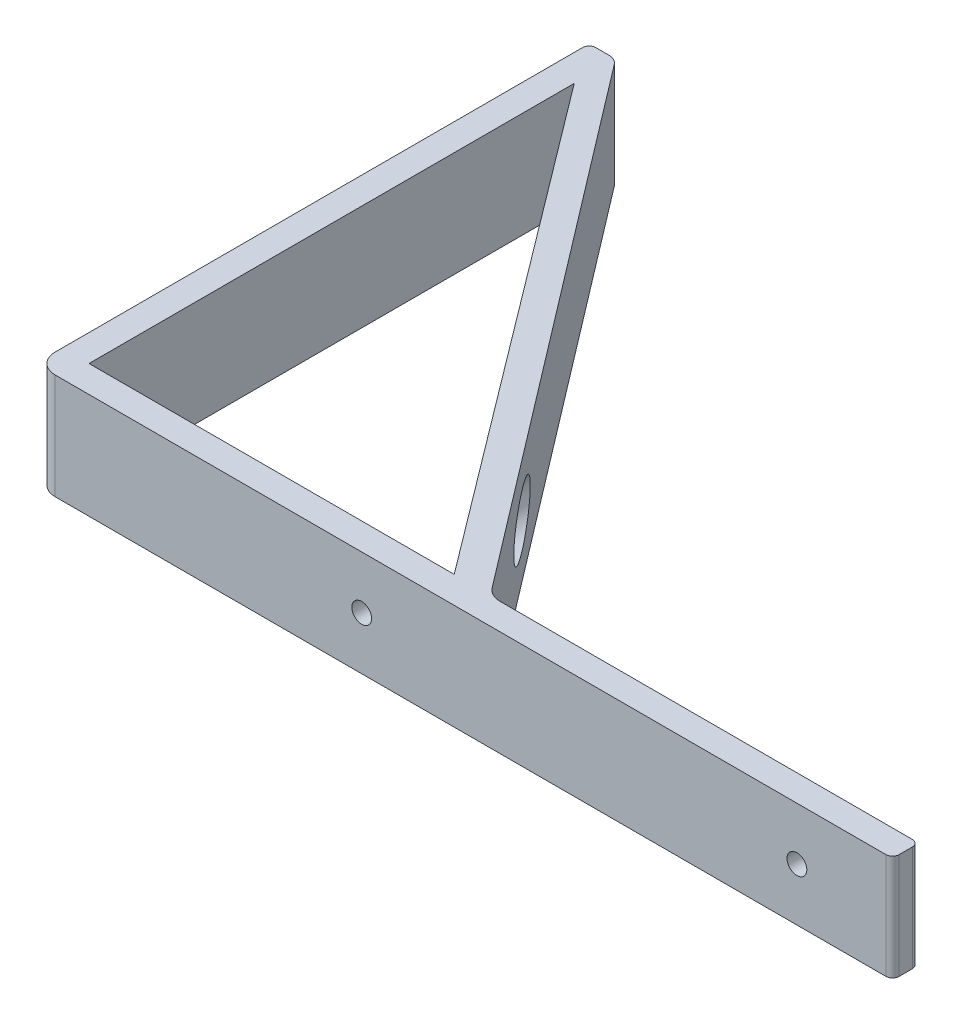
ISO-10303-21;
HEADER;
FILE_DESCRIPTION(('STEP AP214'),'2;1');
FILE_NAME('part.step','',(''),(''),'','','');
FILE_SCHEMA(('AUTOMOTIVE_DESIGN { 1 0 10303 214 1 1 1 1 }'));
ENDSEC;
DATA;
#1=APPLICATION_CONTEXT('core data for automotive mechanical design processes');
#2=APPLICATION_PROTOCOL_DEFINITION('international standard','automotive_design',2000,#1);
#3=PRODUCT_CONTEXT('',#1,'mechanical');
#4=PRODUCT('Part','Part','',(#3));
#5=PRODUCT_RELATED_PRODUCT_CATEGORY('part','',(#4));
#6=PRODUCT_DEFINITION_FORMATION('','',#4);
#7=PRODUCT_DEFINITION_CONTEXT('part definition',#1,'design');
#8=PRODUCT_DEFINITION('design','',#6,#7);
#9=PRODUCT_DEFINITION_SHAPE('','',#8);
#10=(LENGTH_UNIT() NAMED_UNIT(*) SI_UNIT(.MILLI.,.METRE.));
#11=(NAMED_UNIT(*) PLANE_ANGLE_UNIT() SI_UNIT($,.RADIAN.));
#12=(NAMED_UNIT(*) SI_UNIT($,.STERADIAN.) SOLID_ANGLE_UNIT());
#13=UNCERTAINTY_MEASURE_WITH_UNIT(LENGTH_MEASURE(1.E-05),#10,'distance_accuracy_value','');
#14=(GEOMETRIC_REPRESENTATION_CONTEXT(3) GLOBAL_UNCERTAINTY_ASSIGNED_CONTEXT((#13)) GLOBAL_UNIT_ASSIGNED_CONTEXT((#10,
#11,#12)) REPRESENTATION_CONTEXT('',''));
#15=CARTESIAN_POINT('',(0.,0.,0.));
#16=DIRECTION('',(0.,0.,1.));
#17=DIRECTION('',(1.,0.,0.));
#18=AXIS2_PLACEMENT_3D('',#15,#16,#17);
#19=CARTESIAN_POINT('',(-102.832594316858,16.,-4.60648524114411));
#20=DIRECTION('',(0.,1.,0.));
#21=DIRECTION('',(0.,0.,1.));
#22=AXIS2_PLACEMENT_3D('',#19,#20,#21);
#23=PLANE('',#22);
#24=CARTESIAN_POINT('',(-102.832594316858,16.,-4.60648524114411));
#25=DIRECTION('',(0.,1.,0.));
#26=DIRECTION('',(0.,0.,1.));
#27=AXIS2_PLACEMENT_3D('',#24,#25,#26);
#28=CIRCLE('',#27,3.);
#29=CARTESIAN_POINT('',(-105.832594316858,16.,-4.60648524114411));
#30=VERTEX_POINT('',#29);
#31=CARTESIAN_POINT('',(-102.832594316858,16.,-1.60648524114411));
#32=VERTEX_POINT('',#31);
#33=EDGE_CURVE('E170',#30,#32,#28,.T.);
#34=ORIENTED_EDGE('',*,*,#33,.T.);
#35=DIRECTION('',(1.,0.,0.));
#36=VECTOR('',#35,1.);
#37=CARTESIAN_POINT('',(-102.832594316858,16.,-1.60648524114411));
#38=LINE('',#37,#36);
#39=CARTESIAN_POINT('',(23.1674056831416,16.,-1.60648524114411));
#40=VERTEX_POINT('',#39);
#41=EDGE_CURVE('E173',#32,#40,#38,.T.);
#42=ORIENTED_EDGE('',*,*,#41,.T.);
#43=CARTESIAN_POINT('',(23.1674056831416,16.,-2.60648524114411));
#44=DIRECTION('',(0.,1.,0.));
#45=DIRECTION('',(0.,0.,1.));
#46=AXIS2_PLACEMENT_3D('',#43,#44,#45);
#47=CIRCLE('',#46,1.);
#48=CARTESIAN_POINT('',(24.1674056831416,16.,-2.60648524114411));
#49=VERTEX_POINT('',#48);
#50=EDGE_CURVE('E176',#40,#49,#47,.T.);
#51=ORIENTED_EDGE('',*,*,#50,.T.);
#52=DIRECTION('',(0.,0.,1.));
#53=VECTOR('',#52,1.);
#54=CARTESIAN_POINT('',(24.1674056831416,16.,-4.60648524114411));
#55=LINE('',#54,#53);
#56=CARTESIAN_POINT('',(24.1674056831416,16.,-4.60648524114411));
#57=VERTEX_POINT('',#56);
#58=EDGE_CURVE('E178',#57,#49,#55,.T.);
#59=ORIENTED_EDGE('',*,*,#58,.F.);
#60=CARTESIAN_POINT('',(23.1674056831416,16.,-4.60648524114411));
#61=DIRECTION('',(0.,1.,0.));
#62=DIRECTION('',(0.,0.,1.));
#63=AXIS2_PLACEMENT_3D('',#60,#61,#62);
#64=CIRCLE('',#63,1.);
#65=CARTESIAN_POINT('',(23.1674056831416,16.,-5.60648524114411));
#66=VERTEX_POINT('',#65);
#67=EDGE_CURVE('E181',#57,#66,#64,.T.);
#68=ORIENTED_EDGE('',*,*,#67,.T.);
#69=DIRECTION('',(1.,0.,0.));
#70=VECTOR('',#69,1.);
#71=CARTESIAN_POINT('',(-39.3524200308223,16.,-5.60648524114411));
#72=LINE('',#71,#70);
#73=CARTESIAN_POINT('',(-39.3524200308223,16.,-5.60648524114411));
#74=VERTEX_POINT('',#73);
#75=EDGE_CURVE('E183',#74,#66,#72,.T.);
#76=ORIENTED_EDGE('',*,*,#75,.F.);
#77=CARTESIAN_POINT('',(-39.3524200308223,16.,-8.6064852411441));
#78=DIRECTION('',(0.,1.,0.));
#79=DIRECTION('',(0.,0.,1.));
#80=AXIS2_PLACEMENT_3D('',#77,#78,#79);
#81=CIRCLE('',#80,3.00000000000001);
#82=CARTESIAN_POINT('',(-41.7380304850673,16.,-6.78745726978226));
#83=VERTEX_POINT('',#82);
#84=EDGE_CURVE('E186',#83,#74,#81,.T.);
#85=ORIENTED_EDGE('',*,*,#84,.F.);
#86=DIRECTION('',(0.606342657120614,0.,0.795203484748346));
#87=VECTOR('',#86,1.);
#88=CARTESIAN_POINT('',(-101.232266868967,16.,-84.8126853142412));
#89=LINE('',#88,#87);
#90=CARTESIAN_POINT('',(-101.232266868967,16.,-84.8126853142412));
#91=VERTEX_POINT('',#90);
#92=EDGE_CURVE('E189',#91,#83,#89,.T.);
#93=ORIENTED_EDGE('',*,*,#92,.F.);
#94=CARTESIAN_POINT('',(-102.822673838464,16.,-83.6));
#95=DIRECTION('',(0.,-1.,0.));
#96=DIRECTION('',(0.,0.,-1.));
#97=AXIS2_PLACEMENT_3D('',#94,#95,#96);
#98=CIRCLE('',#97,2.);
#99=CARTESIAN_POINT('',(-102.822673838464,16.,-85.6));
#100=VERTEX_POINT('',#99);
#101=EDGE_CURVE('E192',#100,#91,#98,.T.);
#102=ORIENTED_EDGE('',*,*,#101,.F.);
#103=DIRECTION('',(1.,0.,0.));
#104=VECTOR('',#103,1.);
#105=CARTESIAN_POINT('',(-104.832594316858,16.,-85.6));
#106=LINE('',#105,#104);
#107=CARTESIAN_POINT('',(-104.832594316858,16.,-85.6));
#108=VERTEX_POINT('',#107);
#109=EDGE_CURVE('E195',#108,#100,#106,.T.);
#110=ORIENTED_EDGE('',*,*,#109,.F.);
#111=CARTESIAN_POINT('',(-104.832594316858,16.,-84.6));
#112=DIRECTION('',(0.,1.,0.));
#113=DIRECTION('',(0.,0.,1.));
#114=AXIS2_PLACEMENT_3D('',#111,#112,#113);
#115=CIRCLE('',#114,1.);
#116=CARTESIAN_POINT('',(-105.832594316858,16.,-84.6));
#117=VERTEX_POINT('',#116);
#118=EDGE_CURVE('E198',#108,#117,#115,.T.);
#119=ORIENTED_EDGE('',*,*,#118,.T.);
#120=DIRECTION('',(0.,0.,-1.));
#121=VECTOR('',#120,1.);
#122=CARTESIAN_POINT('',(-105.832594316858,16.,-5.59999999999999));
#123=LINE('',#122,#121);
#124=EDGE_CURVE('E200',#30,#117,#123,.T.);
#125=ORIENTED_EDGE('',*,*,#124,.F.);
#126=EDGE_LOOP('',(#34,#42,#51,#59,#68,#76,#85,#93,#102,#110,#119,#125));
#127=FACE_BOUND('',#126,.T.);
#128=DIRECTION('',(1.,0.,0.));
#129=VECTOR('',#128,1.);
#130=CARTESIAN_POINT('',(-101.761672648414,16.,-5.67740690958808));
#131=LINE('',#130,#129);
#132=CARTESIAN_POINT('',(-101.761672648414,16.,-5.67740690958808));
#133=VERTEX_POINT('',#132);
#134=CARTESIAN_POINT('',(-46.3765232221607,16.,-5.67740690958808));
#135=VERTEX_POINT('',#134);
#136=EDGE_CURVE('E151',#133,#135,#131,.T.);
#137=ORIENTED_EDGE('',*,*,#136,.F.);
#138=DIRECTION('',(0.,0.,-1.));
#139=VECTOR('',#138,1.);
#140=CARTESIAN_POINT('',(-101.761672648414,16.,-5.67740690958808));
#141=LINE('',#140,#139);
#142=CARTESIAN_POINT('',(-101.761672648414,16.,-79.2663502076995));
#143=VERTEX_POINT('',#142);
#144=EDGE_CURVE('E50',#133,#143,#141,.T.);
#145=ORIENTED_EDGE('',*,*,#144,.T.);
#146=DIRECTION('',(0.601343340428703,0.,0.798990730185306));
#147=VECTOR('',#146,1.);
#148=CARTESIAN_POINT('',(-101.761672648414,16.,-79.2663502076995));
#149=LINE('',#148,#147);
#150=EDGE_CURVE('E156',#143,#135,#149,.T.);
#151=ORIENTED_EDGE('',*,*,#150,.T.);
#152=EDGE_LOOP('',(#137,#145,#151));
#153=FACE_BOUND('',#152,.T.);
#154=ADVANCED_FACE('F33',(#127,#153),#23,.T.);
#155=CARTESIAN_POINT('',(-102.832594316858,0.,-4.60648524114411));
#156=DIRECTION('',(0.,1.,0.));
#157=DIRECTION('',(0.,0.,1.));
#158=AXIS2_PLACEMENT_3D('',#155,#156,#157);
#159=PLANE('',#158);
#160=CARTESIAN_POINT('',(-102.832594316858,0.,-4.60648524114411));
#161=DIRECTION('',(0.,1.,0.));
#162=DIRECTION('',(0.,0.,1.));
#163=AXIS2_PLACEMENT_3D('',#160,#161,#162);
#164=CIRCLE('',#163,3.);
#165=CARTESIAN_POINT('',(-105.832594316858,0.,-4.60648524114411));
#166=VERTEX_POINT('',#165);
#167=CARTESIAN_POINT('',(-102.832594316858,0.,-1.60648524114411));
#168=VERTEX_POINT('',#167);
#169=EDGE_CURVE('E157',#166,#168,#164,.T.);
#170=ORIENTED_EDGE('',*,*,#169,.F.);
#171=DIRECTION('',(0.,0.,1.));
#172=VECTOR('',#171,1.);
#173=CARTESIAN_POINT('',(-105.832594316858,0.,-5.59999999999999));
#174=LINE('',#173,#172);
#175=CARTESIAN_POINT('',(-105.832594316858,0.,-84.6));
#176=VERTEX_POINT('',#175);
#177=EDGE_CURVE('E174',#176,#166,#174,.T.);
#178=ORIENTED_EDGE('',*,*,#177,.F.);
#179=CARTESIAN_POINT('',(-104.832594316858,0.,-84.6));
#180=DIRECTION('',(0.,1.,0.));
#181=DIRECTION('',(0.,0.,1.));
#182=AXIS2_PLACEMENT_3D('',#179,#180,#181);
#183=CIRCLE('',#182,1.);
#184=CARTESIAN_POINT('',(-104.832594316858,0.,-85.6));
#185=VERTEX_POINT('',#184);
#186=EDGE_CURVE('E232',#185,#176,#183,.T.);
#187=ORIENTED_EDGE('',*,*,#186,.F.);
#188=DIRECTION('',(1.,0.,0.));
#189=VECTOR('',#188,1.);
#190=CARTESIAN_POINT('',(-104.832594316858,0.,-85.6));
#191=LINE('',#190,#189);
#192=CARTESIAN_POINT('',(-102.822673838464,0.,-85.6));
#193=VERTEX_POINT('',#192);
#194=EDGE_CURVE('E229',#185,#193,#191,.T.);
#195=ORIENTED_EDGE('',*,*,#194,.T.);
#196=CARTESIAN_POINT('',(-102.822673838464,0.,-83.6));
#197=DIRECTION('',(0.,-1.,0.));
#198=DIRECTION('',(0.,0.,-1.));
#199=AXIS2_PLACEMENT_3D('',#196,#197,#198);
#200=CIRCLE('',#199,2.);
#201=CARTESIAN_POINT('',(-101.232266868967,0.,-84.8126853142412));
#202=VERTEX_POINT('',#201);
#203=EDGE_CURVE('E226',#193,#202,#200,.T.);
#204=ORIENTED_EDGE('',*,*,#203,.T.);
#205=DIRECTION('',(0.606342657120614,0.,0.795203484748346));
#206=VECTOR('',#205,1.);
#207=CARTESIAN_POINT('',(-101.232266868967,0.,-84.8126853142412));
#208=LINE('',#207,#206);
#209=CARTESIAN_POINT('',(-41.7380304850673,0.,-6.78745726978226));
#210=VERTEX_POINT('',#209);
#211=EDGE_CURVE('E223',#202,#210,#208,.T.);
#212=ORIENTED_EDGE('',*,*,#211,.T.);
#213=CARTESIAN_POINT('',(-39.3524200308223,0.,-8.6064852411441));
#214=DIRECTION('',(0.,1.,0.));
#215=DIRECTION('',(0.,0.,1.));
#216=AXIS2_PLACEMENT_3D('',#213,#214,#215);
#217=CIRCLE('',#216,3.00000000000001);
#218=CARTESIAN_POINT('',(-39.3524200308223,0.,-5.60648524114411));
#219=VERTEX_POINT('',#218);
#220=EDGE_CURVE('E220',#210,#219,#217,.T.);
#221=ORIENTED_EDGE('',*,*,#220,.T.);
#222=DIRECTION('',(1.,0.,0.));
#223=VECTOR('',#222,1.);
#224=CARTESIAN_POINT('',(-39.3524200308223,0.,-5.60648524114411));
#225=LINE('',#224,#223);
#226=CARTESIAN_POINT('',(23.1674056831416,0.,-5.60648524114411));
#227=VERTEX_POINT('',#226);
#228=EDGE_CURVE('E217',#219,#227,#225,.T.);
#229=ORIENTED_EDGE('',*,*,#228,.T.);
#230=CARTESIAN_POINT('',(23.1674056831416,0.,-4.60648524114411));
#231=DIRECTION('',(0.,1.,0.));
#232=DIRECTION('',(0.,0.,1.));
#233=AXIS2_PLACEMENT_3D('',#230,#231,#232);
#234=CIRCLE('',#233,1.);
#235=CARTESIAN_POINT('',(24.1674056831416,0.,-4.60648524114411));
#236=VERTEX_POINT('',#235);
#237=EDGE_CURVE('E214',#236,#227,#234,.T.);
#238=ORIENTED_EDGE('',*,*,#237,.F.);
#239=DIRECTION('',(0.,0.,1.));
#240=VECTOR('',#239,1.);
#241=CARTESIAN_POINT('',(24.1674056831416,0.,-4.60648524114411));
#242=LINE('',#241,#240);
#243=CARTESIAN_POINT('',(24.1674056831416,0.,-2.60648524114411));
#244=VERTEX_POINT('',#243);
#245=EDGE_CURVE('E211',#236,#244,#242,.T.);
#246=ORIENTED_EDGE('',*,*,#245,.T.);
#247=CARTESIAN_POINT('',(23.1674056831416,0.,-2.60648524114411));
#248=DIRECTION('',(0.,1.,0.));
#249=DIRECTION('',(0.,0.,1.));
#250=AXIS2_PLACEMENT_3D('',#247,#248,#249);
#251=CIRCLE('',#250,1.);
#252=CARTESIAN_POINT('',(23.1674056831416,0.,-1.60648524114411));
#253=VERTEX_POINT('',#252);
#254=EDGE_CURVE('E208',#253,#244,#251,.T.);
#255=ORIENTED_EDGE('',*,*,#254,.F.);
#256=DIRECTION('',(1.,0.,0.));
#257=VECTOR('',#256,1.);
#258=CARTESIAN_POINT('',(-102.832594316858,0.,-1.60648524114411));
#259=LINE('',#258,#257);
#260=EDGE_CURVE('E206',#168,#253,#259,.T.);
#261=ORIENTED_EDGE('',*,*,#260,.F.);
#262=EDGE_LOOP('',(#170,#178,#187,#195,#204,#212,#221,#229,#238,#246,#255,#261));
#263=FACE_BOUND('',#262,.T.);
#264=DIRECTION('',(0.,0.,-1.));
#265=VECTOR('',#264,1.);
#266=CARTESIAN_POINT('',(-101.761672648414,0.,-5.67740690958808));
#267=LINE('',#266,#265);
#268=CARTESIAN_POINT('',(-101.761672648414,0.,-5.67740690958808));
#269=VERTEX_POINT('',#268);
#270=CARTESIAN_POINT('',(-101.761672648414,0.,-79.2663502076995));
#271=VERTEX_POINT('',#270);
#272=EDGE_CURVE('E142',#269,#271,#267,.T.);
#273=ORIENTED_EDGE('',*,*,#272,.F.);
#274=DIRECTION('',(1.,0.,0.));
#275=VECTOR('',#274,1.);
#276=CARTESIAN_POINT('',(-101.761672648414,0.,-5.67740690958808));
#277=LINE('',#276,#275);
#278=CARTESIAN_POINT('',(-46.3765232221607,0.,-5.67740690958808));
#279=VERTEX_POINT('',#278);
#280=EDGE_CURVE('E160',#269,#279,#277,.T.);
#281=ORIENTED_EDGE('',*,*,#280,.T.);
#282=DIRECTION('',(0.601343340428703,0.,0.798990730185306));
#283=VECTOR('',#282,1.);
#284=CARTESIAN_POINT('',(-101.761672648414,0.,-79.2663502076995));
#285=LINE('',#284,#283);
#286=EDGE_CURVE('E150',#271,#279,#285,.T.);
#287=ORIENTED_EDGE('',*,*,#286,.F.);
#288=EDGE_LOOP('',(#273,#281,#287));
#289=FACE_BOUND('',#288,.T.);
#290=ADVANCED_FACE('F159',(#263,#289),#159,.F.);
#291=CARTESIAN_POINT('',(-102.832594316858,16.,-4.60648524114411));
#292=DIRECTION('',(0.,-1.,0.));
#293=DIRECTION('',(0.,0.,-1.));
#294=AXIS2_PLACEMENT_3D('',#291,#292,#293);
#295=CYLINDRICAL_SURFACE('',#294,3.);
#296=ORIENTED_EDGE('',*,*,#169,.T.);
#297=DIRECTION('',(0.,-1.,0.));
#298=VECTOR('',#297,1.);
#299=CARTESIAN_POINT('',(-102.832594316858,16.,-1.60648524114411));
#300=LINE('',#299,#298);
#301=EDGE_CURVE('E11',#32,#168,#300,.T.);
#302=ORIENTED_EDGE('',*,*,#301,.F.);
#303=ORIENTED_EDGE('',*,*,#33,.F.);
#304=DIRECTION('',(0.,-1.,0.));
#305=VECTOR('',#304,1.);
#306=CARTESIAN_POINT('',(-105.832594316858,16.,-4.60648524114411));
#307=LINE('',#306,#305);
#308=EDGE_CURVE('E203',#30,#166,#307,.T.);
#309=ORIENTED_EDGE('',*,*,#308,.T.);
#310=EDGE_LOOP('',(#296,#302,#303,#309));
#311=FACE_BOUND('',#310,.T.);
#312=ADVANCED_FACE('F35',(#311),#295,.T.);
#313=CARTESIAN_POINT('',(-102.832594316858,16.,-1.60648524114411));
#314=DIRECTION('',(0.,0.,-1.));
#315=DIRECTION('',(-1.,0.,0.));
#316=AXIS2_PLACEMENT_3D('',#313,#314,#315);
#317=PLANE('',#316);
#318=CARTESIAN_POINT('',(-56.3325943168583,8.,-1.60648524114411));
#319=DIRECTION('',(0.,0.,1.));
#320=DIRECTION('',(1.,0.,0.));
#321=AXIS2_PLACEMENT_3D('',#318,#319,#320);
#322=CIRCLE('',#321,1.5);
#323=CARTESIAN_POINT('',(-54.8325943168583,8.,-1.60648524114411));
#324=VERTEX_POINT('',#323);
#325=EDGE_CURVE('E260',#324,#324,#322,.T.);
#326=ORIENTED_EDGE('',*,*,#325,.F.);
#327=EDGE_LOOP('',(#326));
#328=FACE_BOUND('',#327,.T.);
#329=CARTESIAN_POINT('',(9.66740568314165,8.,-1.60648524114411));
#330=DIRECTION('',(0.,0.,1.));
#331=DIRECTION('',(1.,0.,0.));
#332=AXIS2_PLACEMENT_3D('',#329,#330,#331);
#333=CIRCLE('',#332,1.5);
#334=CARTESIAN_POINT('',(11.1674056831416,8.,-1.60648524114411));
#335=VERTEX_POINT('',#334);
#336=EDGE_CURVE('E265',#335,#335,#333,.T.);
#337=ORIENTED_EDGE('',*,*,#336,.F.);
#338=EDGE_LOOP('',(#337));
#339=FACE_BOUND('',#338,.T.);
#340=ORIENTED_EDGE('',*,*,#260,.T.);
#341=DIRECTION('',(0.,-1.,0.));
#342=VECTOR('',#341,1.);
#343=CARTESIAN_POINT('',(23.1674056831416,16.,-1.60648524114411));
#344=LINE('',#343,#342);
#345=EDGE_CURVE('E42',#40,#253,#344,.T.);
#346=ORIENTED_EDGE('',*,*,#345,.F.);
#347=ORIENTED_EDGE('',*,*,#41,.F.);
#348=ORIENTED_EDGE('',*,*,#301,.T.);
#349=EDGE_LOOP('',(#340,#346,#347,#348));
#350=FACE_BOUND('',#349,.T.);
#351=ADVANCED_FACE('F342',(#328,#339,#350),#317,.F.);
#352=CARTESIAN_POINT('',(23.1674056831416,16.,-2.60648524114411));
#353=DIRECTION('',(0.,-1.,0.));
#354=DIRECTION('',(0.,0.,-1.));
#355=AXIS2_PLACEMENT_3D('',#352,#353,#354);
#356=CYLINDRICAL_SURFACE('',#355,1.);
#357=ORIENTED_EDGE('',*,*,#254,.T.);
#358=DIRECTION('',(0.,-1.,0.));
#359=VECTOR('',#358,1.);
#360=CARTESIAN_POINT('',(24.1674056831416,16.,-2.60648524114411));
#361=LINE('',#360,#359);
#362=EDGE_CURVE('E255',#49,#244,#361,.T.);
#363=ORIENTED_EDGE('',*,*,#362,.F.);
#364=ORIENTED_EDGE('',*,*,#50,.F.);
#365=ORIENTED_EDGE('',*,*,#345,.T.);
#366=EDGE_LOOP('',(#357,#363,#364,#365));
#367=FACE_BOUND('',#366,.T.);
#368=ADVANCED_FACE('F339',(#367),#356,.T.);
#369=CARTESIAN_POINT('',(24.1674056831416,16.,-4.60648524114411));
#370=DIRECTION('',(1.,0.,0.));
#371=DIRECTION('',(0.,0.,-1.));
#372=AXIS2_PLACEMENT_3D('',#369,#370,#371);
#373=PLANE('',#372);
#374=ORIENTED_EDGE('',*,*,#245,.F.);
#375=DIRECTION('',(0.,-1.,0.));
#376=VECTOR('',#375,1.);
#377=CARTESIAN_POINT('',(24.1674056831416,16.,-4.60648524114411));
#378=LINE('',#377,#376);
#379=EDGE_CURVE('E253',#57,#236,#378,.T.);
#380=ORIENTED_EDGE('',*,*,#379,.F.);
#381=ORIENTED_EDGE('',*,*,#58,.T.);
#382=ORIENTED_EDGE('',*,*,#362,.T.);
#383=EDGE_LOOP('',(#374,#380,#381,#382));
#384=FACE_BOUND('',#383,.T.);
#385=ADVANCED_FACE('F335',(#384),#373,.T.);
#386=CARTESIAN_POINT('',(23.1674056831416,16.,-4.60648524114411));
#387=DIRECTION('',(0.,-1.,0.));
#388=DIRECTION('',(0.,0.,-1.));
#389=AXIS2_PLACEMENT_3D('',#386,#387,#388);
#390=CYLINDRICAL_SURFACE('',#389,1.);
#391=ORIENTED_EDGE('',*,*,#237,.T.);
#392=DIRECTION('',(0.,-1.,0.));
#393=VECTOR('',#392,1.);
#394=CARTESIAN_POINT('',(23.1674056831416,16.,-5.60648524114411));
#395=LINE('',#394,#393);
#396=EDGE_CURVE('E251',#66,#227,#395,.T.);
#397=ORIENTED_EDGE('',*,*,#396,.F.);
#398=ORIENTED_EDGE('',*,*,#67,.F.);
#399=ORIENTED_EDGE('',*,*,#379,.T.);
#400=EDGE_LOOP('',(#391,#397,#398,#399));
#401=FACE_BOUND('',#400,.T.);
#402=ADVANCED_FACE('F331',(#401),#390,.T.);
#403=CARTESIAN_POINT('',(-39.3524200308223,16.,-5.60648524114411));
#404=DIRECTION('',(0.,0.,-1.));
#405=DIRECTION('',(-1.,0.,0.));
#406=AXIS2_PLACEMENT_3D('',#403,#404,#405);
#407=PLANE('',#406);
#408=CARTESIAN_POINT('',(9.66740568314165,8.,-5.60648524114411));
#409=DIRECTION('',(0.,0.,-1.));
#410=DIRECTION('',(-1.,0.,0.));
#411=AXIS2_PLACEMENT_3D('',#408,#409,#410);
#412=CIRCLE('',#411,1.5);
#413=CARTESIAN_POINT('',(8.16740568314165,8.,-5.60648524114411));
#414=VERTEX_POINT('',#413);
#415=EDGE_CURVE('E37',#414,#414,#412,.T.);
#416=ORIENTED_EDGE('',*,*,#415,.F.);
#417=EDGE_LOOP('',(#416));
#418=FACE_BOUND('',#417,.T.);
#419=ORIENTED_EDGE('',*,*,#228,.F.);
#420=DIRECTION('',(0.,-1.,0.));
#421=VECTOR('',#420,1.);
#422=CARTESIAN_POINT('',(-39.3524200308223,16.,-5.60648524114411));
#423=LINE('',#422,#421);
#424=EDGE_CURVE('E249',#74,#219,#423,.T.);
#425=ORIENTED_EDGE('',*,*,#424,.F.);
#426=ORIENTED_EDGE('',*,*,#75,.T.);
#427=ORIENTED_EDGE('',*,*,#396,.T.);
#428=EDGE_LOOP('',(#419,#425,#426,#427));
#429=FACE_BOUND('',#428,.T.);
#430=ADVANCED_FACE('F327',(#418,#429),#407,.T.);
#431=CARTESIAN_POINT('',(-39.3524200308223,16.,-8.6064852411441));
#432=DIRECTION('',(0.,-1.,0.));
#433=DIRECTION('',(0.,0.,-1.));
#434=AXIS2_PLACEMENT_3D('',#431,#432,#433);
#435=CYLINDRICAL_SURFACE('',#434,3.00000000000001);
#436=ORIENTED_EDGE('',*,*,#220,.F.);
#437=DIRECTION('',(0.,-1.,0.));
#438=VECTOR('',#437,1.);
#439=CARTESIAN_POINT('',(-41.7380304850673,16.,-6.78745726978226));
#440=LINE('',#439,#438);
#441=EDGE_CURVE('E247',#83,#210,#440,.T.);
#442=ORIENTED_EDGE('',*,*,#441,.F.);
#443=ORIENTED_EDGE('',*,*,#84,.T.);
#444=ORIENTED_EDGE('',*,*,#424,.T.);
#445=EDGE_LOOP('',(#436,#442,#443,#444));
#446=FACE_BOUND('',#445,.T.);
#447=ADVANCED_FACE('F323',(#446),#435,.F.);
#448=CARTESIAN_POINT('',(-101.232266868967,16.,-84.8126853142412));
#449=DIRECTION('',(0.795203484748346,0.,-0.606342657120614));
#450=DIRECTION('',(-0.606342657120614,0.,-0.795203484748346));
#451=AXIS2_PLACEMENT_3D('',#448,#449,#450);
#452=PLANE('',#451);
#453=CARTESIAN_POINT('',(-56.2975827920704,7.99999999999999,-25.8819520986388));
#454=DIRECTION('',(0.795203484748346,0.,-0.606342657120614));
#455=DIRECTION('',(0.606342657120614,0.,0.795203484748346));
#456=AXIS2_PLACEMENT_3D('',#453,#454,#455);
#457=ELLIPSE('',#456,6.59692989273607,4.);
#458=CARTESIAN_POINT('',(-52.2975827920704,7.99999999999999,-20.6360504592945));
#459=VERTEX_POINT('',#458);
#460=EDGE_CURVE('E270',#459,#459,#457,.F.);
#461=ORIENTED_EDGE('',*,*,#460,.T.);
#462=EDGE_LOOP('',(#461));
#463=FACE_BOUND('',#462,.T.);
#464=ORIENTED_EDGE('',*,*,#211,.F.);
#465=DIRECTION('',(0.,-1.,0.));
#466=VECTOR('',#465,1.);
#467=CARTESIAN_POINT('',(-101.232266868967,16.,-84.8126853142412));
#468=LINE('',#467,#466);
#469=EDGE_CURVE('E245',#91,#202,#468,.T.);
#470=ORIENTED_EDGE('',*,*,#469,.F.);
#471=ORIENTED_EDGE('',*,*,#92,.T.);
#472=ORIENTED_EDGE('',*,*,#441,.T.);
#473=EDGE_LOOP('',(#464,#470,#471,#472));
#474=FACE_BOUND('',#473,.T.);
#475=ADVANCED_FACE('F319',(#463,#474),#452,.T.);
#476=CARTESIAN_POINT('',(-102.822673838464,16.,-83.6));
#477=DIRECTION('',(0.,-1.,0.));
#478=DIRECTION('',(0.,0.,-1.));
#479=AXIS2_PLACEMENT_3D('',#476,#477,#478);
#480=CYLINDRICAL_SURFACE('',#479,2.);
#481=ORIENTED_EDGE('',*,*,#203,.F.);
#482=DIRECTION('',(0.,-1.,0.));
#483=VECTOR('',#482,1.);
#484=CARTESIAN_POINT('',(-102.822673838464,16.,-85.6));
#485=LINE('',#484,#483);
#486=EDGE_CURVE('E243',#100,#193,#485,.T.);
#487=ORIENTED_EDGE('',*,*,#486,.F.);
#488=ORIENTED_EDGE('',*,*,#101,.T.);
#489=ORIENTED_EDGE('',*,*,#469,.T.);
#490=EDGE_LOOP('',(#481,#487,#488,#489));
#491=FACE_BOUND('',#490,.T.);
#492=ADVANCED_FACE('F315',(#491),#480,.T.);
#493=CARTESIAN_POINT('',(-104.832594316858,16.,-85.6));
#494=DIRECTION('',(0.,0.,-1.));
#495=DIRECTION('',(-1.,0.,0.));
#496=AXIS2_PLACEMENT_3D('',#493,#494,#495);
#497=PLANE('',#496);
#498=ORIENTED_EDGE('',*,*,#194,.F.);
#499=DIRECTION('',(0.,-1.,0.));
#500=VECTOR('',#499,1.);
#501=CARTESIAN_POINT('',(-104.832594316858,16.,-85.6));
#502=LINE('',#501,#500);
#503=EDGE_CURVE('E241',#108,#185,#502,.T.);
#504=ORIENTED_EDGE('',*,*,#503,.F.);
#505=ORIENTED_EDGE('',*,*,#109,.T.);
#506=ORIENTED_EDGE('',*,*,#486,.T.);
#507=EDGE_LOOP('',(#498,#504,#505,#506));
#508=FACE_BOUND('',#507,.T.);
#509=ADVANCED_FACE('F311',(#508),#497,.T.);
#510=CARTESIAN_POINT('',(-104.832594316858,16.,-84.6));
#511=DIRECTION('',(0.,-1.,0.));
#512=DIRECTION('',(0.,0.,-1.));
#513=AXIS2_PLACEMENT_3D('',#510,#511,#512);
#514=CYLINDRICAL_SURFACE('',#513,1.);
#515=ORIENTED_EDGE('',*,*,#186,.T.);
#516=DIRECTION('',(0.,-1.,0.));
#517=VECTOR('',#516,1.);
#518=CARTESIAN_POINT('',(-105.832594316858,16.,-84.6));
#519=LINE('',#518,#517);
#520=EDGE_CURVE('E238',#117,#176,#519,.T.);
#521=ORIENTED_EDGE('',*,*,#520,.F.);
#522=ORIENTED_EDGE('',*,*,#118,.F.);
#523=ORIENTED_EDGE('',*,*,#503,.T.);
#524=EDGE_LOOP('',(#515,#521,#522,#523));
#525=FACE_BOUND('',#524,.T.);
#526=ADVANCED_FACE('F307',(#525),#514,.T.);
#527=CARTESIAN_POINT('',(-105.832594316858,16.,-5.59999999999999));
#528=DIRECTION('',(1.,0.,0.));
#529=DIRECTION('',(0.,0.,-1.));
#530=AXIS2_PLACEMENT_3D('',#527,#528,#529);
#531=PLANE('',#530);
#532=ORIENTED_EDGE('',*,*,#177,.T.);
#533=ORIENTED_EDGE('',*,*,#308,.F.);
#534=ORIENTED_EDGE('',*,*,#124,.T.);
#535=ORIENTED_EDGE('',*,*,#520,.T.);
#536=EDGE_LOOP('',(#532,#533,#534,#535));
#537=FACE_BOUND('',#536,.T.);
#538=ADVANCED_FACE('F304',(#537),#531,.F.);
#539=CARTESIAN_POINT('',(-101.761672648414,0.,-5.67740690958808));
#540=DIRECTION('',(1.,0.,0.));
#541=DIRECTION('',(0.,0.,-1.));
#542=AXIS2_PLACEMENT_3D('',#539,#540,#541);
#543=PLANE('',#542);
#544=ORIENTED_EDGE('',*,*,#144,.F.);
#545=DIRECTION('',(0.,1.,0.));
#546=VECTOR('',#545,1.);
#547=CARTESIAN_POINT('',(-101.761672648414,0.,-5.67740690958808));
#548=LINE('',#547,#546);
#549=EDGE_CURVE('E146',#269,#133,#548,.T.);
#550=ORIENTED_EDGE('',*,*,#549,.F.);
#551=ORIENTED_EDGE('',*,*,#272,.T.);
#552=DIRECTION('',(0.,1.,0.));
#553=VECTOR('',#552,1.);
#554=CARTESIAN_POINT('',(-101.761672648414,0.,-79.2663502076995));
#555=LINE('',#554,#553);
#556=EDGE_CURVE('E145',#271,#143,#555,.T.);
#557=ORIENTED_EDGE('',*,*,#556,.T.);
#558=EDGE_LOOP('',(#544,#550,#551,#557));
#559=FACE_BOUND('',#558,.T.);
#560=ADVANCED_FACE('F144',(#559),#543,.T.);
#561=CARTESIAN_POINT('',(-101.761672648414,0.,-79.2663502076995));
#562=DIRECTION('',(-0.798990730185306,0.,0.601343340428703));
#563=DIRECTION('',(0.601343340428703,0.,0.798990730185306));
#564=AXIS2_PLACEMENT_3D('',#561,#562,#563);
#565=PLANE('',#564);
#566=CARTESIAN_POINT('',(-56.2975827920704,7.99999999999999,-18.8592850431732));
#567=DIRECTION('',(-0.798990730185306,0.,0.601343340428703));
#568=DIRECTION('',(0.601343340428703,0.,0.798990730185306));
#569=AXIS2_PLACEMENT_3D('',#566,#567,#568);
#570=ELLIPSE('',#569,6.65177400509393,4.);
#571=CARTESIAN_POINT('',(-52.2975827920704,7.99999999999999,-13.5445792738155));
#572=VERTEX_POINT('',#571);
#573=EDGE_CURVE('E274',#572,#572,#570,.F.);
#574=ORIENTED_EDGE('',*,*,#573,.T.);
#575=EDGE_LOOP('',(#574));
#576=FACE_BOUND('',#575,.T.);
#577=ORIENTED_EDGE('',*,*,#150,.F.);
#578=ORIENTED_EDGE('',*,*,#556,.F.);
#579=ORIENTED_EDGE('',*,*,#286,.T.);
#580=DIRECTION('',(0.,1.,0.));
#581=VECTOR('',#580,1.);
#582=CARTESIAN_POINT('',(-46.3765232221607,0.,-5.67740690958808));
#583=LINE('',#582,#581);
#584=EDGE_CURVE('E58',#279,#135,#583,.T.);
#585=ORIENTED_EDGE('',*,*,#584,.T.);
#586=EDGE_LOOP('',(#577,#578,#579,#585));
#587=FACE_BOUND('',#586,.T.);
#588=ADVANCED_FACE('F154',(#576,#587),#565,.T.);
#589=CARTESIAN_POINT('',(-101.761672648414,0.,-5.67740690958808));
#590=DIRECTION('',(0.,0.,1.));
#591=DIRECTION('',(1.,0.,0.));
#592=AXIS2_PLACEMENT_3D('',#589,#590,#591);
#593=PLANE('',#592);
#594=ORIENTED_EDGE('',*,*,#136,.T.);
#595=ORIENTED_EDGE('',*,*,#584,.F.);
#596=ORIENTED_EDGE('',*,*,#280,.F.);
#597=ORIENTED_EDGE('',*,*,#549,.T.);
#598=EDGE_LOOP('',(#594,#595,#596,#597));
#599=FACE_BOUND('',#598,.T.);
#600=CARTESIAN_POINT('',(-56.3325943168583,8.,-5.67740690958808));
#601=DIRECTION('',(0.,0.,1.));
#602=DIRECTION('',(1.,0.,0.));
#603=AXIS2_PLACEMENT_3D('',#600,#601,#602);
#604=CIRCLE('',#603,1.5);
#605=CARTESIAN_POINT('',(-54.8325943168583,8.,-5.67740690958808));
#606=VERTEX_POINT('',#605);
#607=EDGE_CURVE('E258',#606,#606,#604,.T.);
#608=ORIENTED_EDGE('',*,*,#607,.T.);
#609=EDGE_LOOP('',(#608));
#610=FACE_BOUND('',#609,.T.);
#611=ADVANCED_FACE('F424',(#599,#610),#593,.F.);
#612=CARTESIAN_POINT('',(-56.3325943168583,8.,-17.6064852411441));
#613=DIRECTION('',(0.,0.,1.));
#614=DIRECTION('',(1.,0.,0.));
#615=AXIS2_PLACEMENT_3D('',#612,#613,#614);
#616=CYLINDRICAL_SURFACE('',#615,1.5);
#617=ORIENTED_EDGE('',*,*,#325,.T.);
#618=EDGE_LOOP('',(#617));
#619=FACE_BOUND('',#618,.T.);
#620=ORIENTED_EDGE('',*,*,#607,.F.);
#621=EDGE_LOOP('',(#620));
#622=FACE_BOUND('',#621,.T.);
#623=ADVANCED_FACE('F287',(#619,#622),#616,.F.);
#624=CARTESIAN_POINT('',(9.66740568314165,8.,-17.6064852411441));
#625=DIRECTION('',(0.,0.,1.));
#626=DIRECTION('',(1.,0.,0.));
#627=AXIS2_PLACEMENT_3D('',#624,#625,#626);
#628=CYLINDRICAL_SURFACE('',#627,1.5);
#629=ORIENTED_EDGE('',*,*,#415,.T.);
#630=EDGE_LOOP('',(#629));
#631=FACE_BOUND('',#630,.T.);
#632=ORIENTED_EDGE('',*,*,#336,.T.);
#633=EDGE_LOOP('',(#632));
#634=FACE_BOUND('',#633,.T.);
#635=ADVANCED_FACE('F281',(#631,#634),#628,.F.);
#636=CARTESIAN_POINT('',(-56.2975827920704,7.99999999999999,-85.6));
#637=DIRECTION('',(0.,0.,1.));
#638=DIRECTION('',(1.,0.,0.));
#639=AXIS2_PLACEMENT_3D('',#636,#637,#638);
#640=CYLINDRICAL_SURFACE('',#639,4.);
#641=ORIENTED_EDGE('',*,*,#460,.F.);
#642=EDGE_LOOP('',(#641));
#643=FACE_BOUND('',#642,.T.);
#644=ORIENTED_EDGE('',*,*,#573,.F.);
#645=EDGE_LOOP('',(#644));
#646=FACE_BOUND('',#645,.T.);
#647=ADVANCED_FACE('F279',(#643,#646),#640,.F.);
#648=CLOSED_SHELL('',(#154,#290,#312,#351,#368,#385,#402,#430,#447,#475,#492,#509,#526,#538,
#560,#588,#611,#623,#635,#647));
#649=MANIFOLD_SOLID_BREP('B2',#648);
#650=ADVANCED_BREP_SHAPE_REPRESENTATION('',(#18,#649),#14);
#651=SHAPE_DEFINITION_REPRESENTATION(#9,#650);
ENDSEC;
END-ISO-10303-21;
